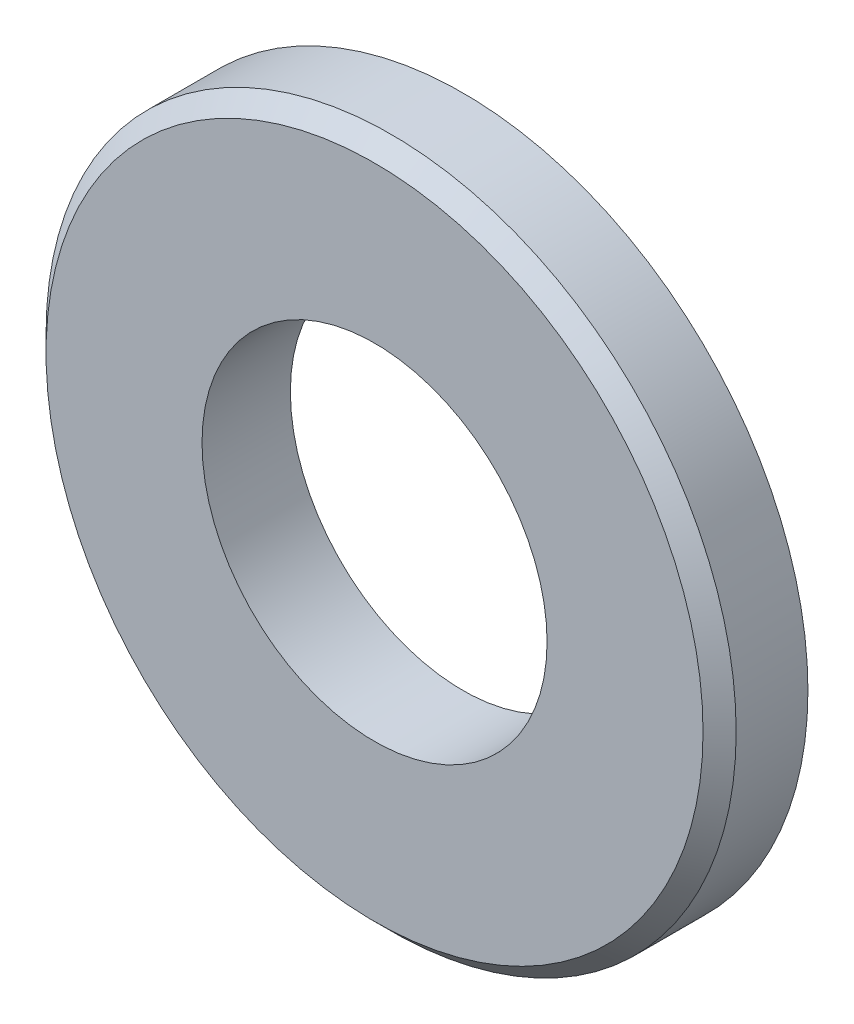
ISO-10303-21;
HEADER;
FILE_DESCRIPTION(('STEP AP214'),'2;1');
FILE_NAME('part.step','',(''),(''),'','','');
FILE_SCHEMA(('AUTOMOTIVE_DESIGN { 1 0 10303 214 1 1 1 1 }'));
ENDSEC;
DATA;
#1=APPLICATION_CONTEXT('core data for automotive mechanical design processes');
#2=APPLICATION_PROTOCOL_DEFINITION('international standard','automotive_design',2000,#1);
#3=PRODUCT_CONTEXT('',#1,'mechanical');
#4=PRODUCT('Part','Part','',(#3));
#5=PRODUCT_RELATED_PRODUCT_CATEGORY('part','',(#4));
#6=PRODUCT_DEFINITION_FORMATION('','',#4);
#7=PRODUCT_DEFINITION_CONTEXT('part definition',#1,'design');
#8=PRODUCT_DEFINITION('design','',#6,#7);
#9=PRODUCT_DEFINITION_SHAPE('','',#8);
#10=(LENGTH_UNIT() NAMED_UNIT(*) SI_UNIT(.MILLI.,.METRE.));
#11=(NAMED_UNIT(*) PLANE_ANGLE_UNIT() SI_UNIT($,.RADIAN.));
#12=(NAMED_UNIT(*) SI_UNIT($,.STERADIAN.) SOLID_ANGLE_UNIT());
#13=UNCERTAINTY_MEASURE_WITH_UNIT(LENGTH_MEASURE(1.E-05),#10,'distance_accuracy_value','');
#14=(GEOMETRIC_REPRESENTATION_CONTEXT(3) GLOBAL_UNCERTAINTY_ASSIGNED_CONTEXT((#13)) GLOBAL_UNIT_ASSIGNED_CONTEXT((#10,
#11,#12)) REPRESENTATION_CONTEXT('',''));
#15=CARTESIAN_POINT('',(0.,0.,0.));
#16=DIRECTION('',(0.,0.,1.));
#17=DIRECTION('',(1.,0.,0.));
#18=AXIS2_PLACEMENT_3D('',#15,#16,#17);
#19=CARTESIAN_POINT('',(0.,0.,1.6));
#20=DIRECTION('',(0.,0.,1.));
#21=DIRECTION('',(1.,0.,0.));
#22=AXIS2_PLACEMENT_3D('',#19,#20,#21);
#23=PLANE('',#22);
#24=CARTESIAN_POINT('',(0.,0.,1.6));
#25=DIRECTION('',(0.,0.,1.));
#26=DIRECTION('',(1.,0.,0.));
#27=AXIS2_PLACEMENT_3D('',#24,#25,#26);
#28=CIRCLE('',#27,5.95000000000001);
#29=CARTESIAN_POINT('',(5.95000000000001,0.,1.6));
#30=VERTEX_POINT('',#29);
#31=EDGE_CURVE('E37',#30,#30,#28,.T.);
#32=ORIENTED_EDGE('',*,*,#31,.T.);
#33=EDGE_LOOP('',(#32));
#34=FACE_BOUND('',#33,.T.);
#35=CARTESIAN_POINT('',(0.,0.,1.6));
#36=DIRECTION('',(0.,0.,1.));
#37=DIRECTION('',(1.,0.,0.));
#38=AXIS2_PLACEMENT_3D('',#35,#36,#37);
#39=CIRCLE('',#38,3.125);
#40=CARTESIAN_POINT('',(3.125,0.,1.6));
#41=VERTEX_POINT('',#40);
#42=EDGE_CURVE('E45',#41,#41,#39,.T.);
#43=ORIENTED_EDGE('',*,*,#42,.F.);
#44=EDGE_LOOP('',(#43));
#45=FACE_BOUND('',#44,.T.);
#46=ADVANCED_FACE('F30',(#34,#45),#23,.T.);
#47=CARTESIAN_POINT('',(0.,0.,0.));
#48=DIRECTION('',(0.,0.,1.));
#49=DIRECTION('',(1.,0.,0.));
#50=AXIS2_PLACEMENT_3D('',#47,#48,#49);
#51=PLANE('',#50);
#52=CARTESIAN_POINT('',(0.,0.,0.));
#53=DIRECTION('',(0.,0.,1.));
#54=DIRECTION('',(1.,0.,0.));
#55=AXIS2_PLACEMENT_3D('',#52,#53,#54);
#56=CIRCLE('',#55,6.25);
#57=CARTESIAN_POINT('',(6.25,0.,0.));
#58=VERTEX_POINT('',#57);
#59=EDGE_CURVE('E41',#58,#58,#56,.T.);
#60=ORIENTED_EDGE('',*,*,#59,.F.);
#61=EDGE_LOOP('',(#60));
#62=FACE_BOUND('',#61,.T.);
#63=CARTESIAN_POINT('',(0.,0.,0.));
#64=DIRECTION('',(0.,0.,1.));
#65=DIRECTION('',(1.,0.,0.));
#66=AXIS2_PLACEMENT_3D('',#63,#64,#65);
#67=CIRCLE('',#66,3.125);
#68=CARTESIAN_POINT('',(3.125,0.,0.));
#69=VERTEX_POINT('',#68);
#70=EDGE_CURVE('E48',#69,#69,#67,.T.);
#71=ORIENTED_EDGE('',*,*,#70,.T.);
#72=EDGE_LOOP('',(#71));
#73=FACE_BOUND('',#72,.T.);
#74=ADVANCED_FACE('F58',(#62,#73),#51,.F.);
#75=CARTESIAN_POINT('',(0.,0.,1.6));
#76=DIRECTION('',(0.,0.,-1.));
#77=DIRECTION('',(-1.,0.,0.));
#78=AXIS2_PLACEMENT_3D('',#75,#76,#77);
#79=CYLINDRICAL_SURFACE('',#78,6.25);
#80=CARTESIAN_POINT('',(0.,0.,1.3));
#81=DIRECTION('',(0.,0.,1.));
#82=DIRECTION('',(1.,0.,0.));
#83=AXIS2_PLACEMENT_3D('',#80,#81,#82);
#84=CIRCLE('',#83,6.25);
#85=CARTESIAN_POINT('',(6.25,0.,1.3));
#86=VERTEX_POINT('',#85);
#87=EDGE_CURVE('E10',#86,#86,#84,.F.);
#88=ORIENTED_EDGE('',*,*,#87,.T.);
#89=EDGE_LOOP('',(#88));
#90=FACE_BOUND('',#89,.T.);
#91=ORIENTED_EDGE('',*,*,#59,.T.);
#92=EDGE_LOOP('',(#91));
#93=FACE_BOUND('',#92,.T.);
#94=ADVANCED_FACE('F63',(#90,#93),#79,.T.);
#95=CARTESIAN_POINT('',(0.,0.,1.6));
#96=DIRECTION('',(0.,0.,-1.));
#97=DIRECTION('',(-1.,0.,0.));
#98=AXIS2_PLACEMENT_3D('',#95,#96,#97);
#99=CYLINDRICAL_SURFACE('',#98,3.125);
#100=ORIENTED_EDGE('',*,*,#42,.T.);
#101=EDGE_LOOP('',(#100));
#102=FACE_BOUND('',#101,.T.);
#103=ORIENTED_EDGE('',*,*,#70,.F.);
#104=EDGE_LOOP('',(#103));
#105=FACE_BOUND('',#104,.T.);
#106=ADVANCED_FACE('F54',(#102,#105),#99,.F.);
#107=CARTESIAN_POINT('',(0.,0.,1.6));
#108=DIRECTION('',(0.,0.,-1.));
#109=DIRECTION('',(-1.,0.,0.));
#110=AXIS2_PLACEMENT_3D('',#107,#108,#109);
#111=CONICAL_SURFACE('',#110,5.95000000000001,0.785398163397448);
#112=ORIENTED_EDGE('',*,*,#87,.F.);
#113=EDGE_LOOP('',(#112));
#114=FACE_BOUND('',#113,.T.);
#115=ORIENTED_EDGE('',*,*,#31,.F.);
#116=EDGE_LOOP('',(#115));
#117=FACE_BOUND('',#116,.T.);
#118=ADVANCED_FACE('F32',(#114,#117),#111,.T.);
#119=CLOSED_SHELL('',(#46,#74,#94,#106,#118));
#120=MANIFOLD_SOLID_BREP('B2',#119);
#121=ADVANCED_BREP_SHAPE_REPRESENTATION('',(#18,#120),#14);
#122=SHAPE_DEFINITION_REPRESENTATION(#9,#121);
ENDSEC;
END-ISO-10303-21;
